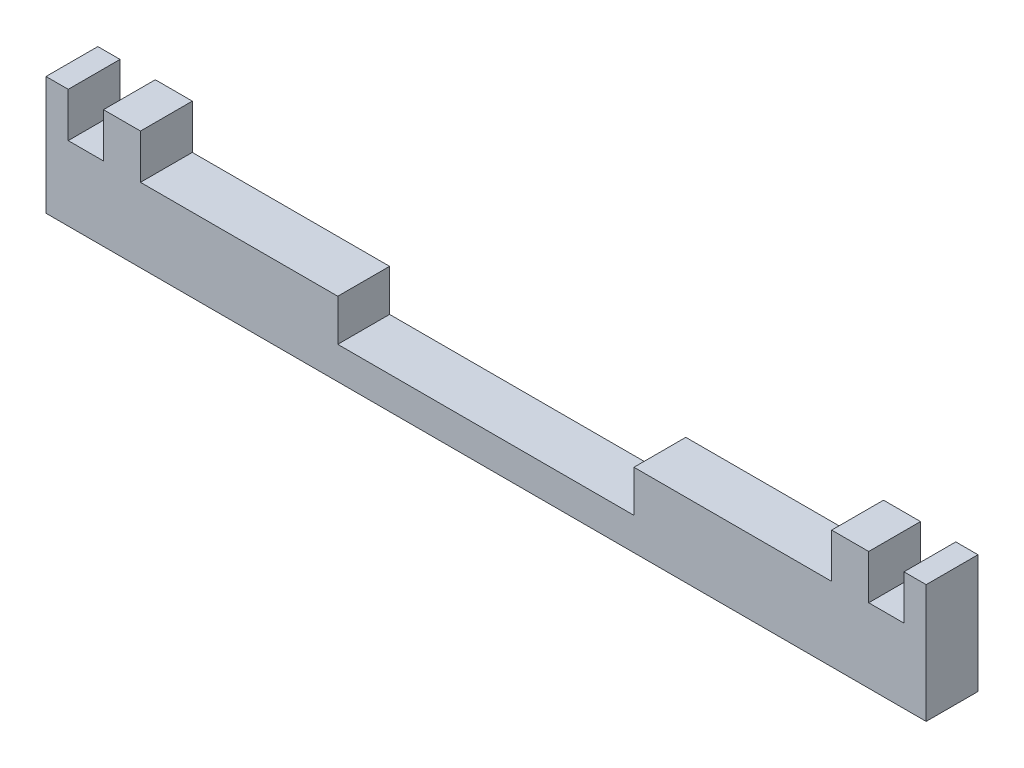
ISO-10303-21;
HEADER;
FILE_DESCRIPTION(('STEP AP214'),'2;1');
FILE_NAME('part.step','',(''),(''),'','','');
FILE_SCHEMA(('AUTOMOTIVE_DESIGN { 1 0 10303 214 1 1 1 1 }'));
ENDSEC;
DATA;
#1=APPLICATION_CONTEXT('core data for automotive mechanical design processes');
#2=APPLICATION_PROTOCOL_DEFINITION('international standard','automotive_design',2000,#1);
#3=PRODUCT_CONTEXT('',#1,'mechanical');
#4=PRODUCT('Part','Part','',(#3));
#5=PRODUCT_RELATED_PRODUCT_CATEGORY('part','',(#4));
#6=PRODUCT_DEFINITION_FORMATION('','',#4);
#7=PRODUCT_DEFINITION_CONTEXT('part definition',#1,'design');
#8=PRODUCT_DEFINITION('design','',#6,#7);
#9=PRODUCT_DEFINITION_SHAPE('','',#8);
#10=(LENGTH_UNIT() NAMED_UNIT(*) SI_UNIT(.MILLI.,.METRE.));
#11=(NAMED_UNIT(*) PLANE_ANGLE_UNIT() SI_UNIT($,.RADIAN.));
#12=(NAMED_UNIT(*) SI_UNIT($,.STERADIAN.) SOLID_ANGLE_UNIT());
#13=UNCERTAINTY_MEASURE_WITH_UNIT(LENGTH_MEASURE(1.E-05),#10,'distance_accuracy_value','');
#14=(GEOMETRIC_REPRESENTATION_CONTEXT(3) GLOBAL_UNCERTAINTY_ASSIGNED_CONTEXT((#13)) GLOBAL_UNIT_ASSIGNED_CONTEXT((#10,
#11,#12)) REPRESENTATION_CONTEXT('',''));
#15=CARTESIAN_POINT('',(0.,0.,0.));
#16=DIRECTION('',(0.,0.,1.));
#17=DIRECTION('',(1.,0.,0.));
#18=AXIS2_PLACEMENT_3D('',#15,#16,#17);
#19=CARTESIAN_POINT('',(39.2998382428941,-10.997149870801,8.89));
#20=DIRECTION('',(0.,-1.,0.));
#21=DIRECTION('',(1.,0.,0.));
#22=AXIS2_PLACEMENT_3D('',#19,#20,#21);
#23=PLANE('',#22);
#24=DIRECTION('',(-1.,0.,0.));
#25=VECTOR('',#24,1.);
#26=CARTESIAN_POINT('',(39.2998382428941,-10.997149870801,8.89));
#27=LINE('',#26,#25);
#28=CARTESIAN_POINT('',(-45.4091617571059,-10.997149870801,8.89));
#29=VERTEX_POINT('',#28);
#30=CARTESIAN_POINT('',(-79.2419617571059,-10.997149870801,8.89));
#31=VERTEX_POINT('',#30);
#32=EDGE_CURVE('E296',#29,#31,#27,.T.);
#33=ORIENTED_EDGE('',*,*,#32,.F.);
#34=DIRECTION('',(0.,0.,1.));
#35=VECTOR('',#34,1.);
#36=CARTESIAN_POINT('',(-45.4091617571059,-10.997149870801,0.));
#37=LINE('',#36,#35);
#38=CARTESIAN_POINT('',(-45.4091617571059,-10.997149870801,0.));
#39=VERTEX_POINT('',#38);
#40=EDGE_CURVE('E196',#39,#29,#37,.T.);
#41=ORIENTED_EDGE('',*,*,#40,.F.);
#42=DIRECTION('',(-1.,0.,0.));
#43=VECTOR('',#42,1.);
#44=CARTESIAN_POINT('',(39.2998382428941,-10.997149870801,0.));
#45=LINE('',#44,#43);
#46=CARTESIAN_POINT('',(-79.2419617571059,-10.997149870801,0.));
#47=VERTEX_POINT('',#46);
#48=EDGE_CURVE('E212',#39,#47,#45,.T.);
#49=ORIENTED_EDGE('',*,*,#48,.T.);
#50=DIRECTION('',(0.,0.,-1.));
#51=VECTOR('',#50,1.);
#52=CARTESIAN_POINT('',(-79.2419617571059,-10.997149870801,8.89));
#53=LINE('',#52,#51);
#54=EDGE_CURVE('E236',#31,#47,#53,.T.);
#55=ORIENTED_EDGE('',*,*,#54,.F.);
#56=EDGE_LOOP('',(#33,#41,#49,#55));
#57=FACE_BOUND('',#56,.T.);
#58=ADVANCED_FACE('F34',(#57),#23,.F.);
#59=CARTESIAN_POINT('',(-95.4471617571059,-3.37714987080101,8.89));
#60=DIRECTION('',(1.,0.,0.));
#61=DIRECTION('',(0.,0.,-1.));
#62=AXIS2_PLACEMENT_3D('',#59,#60,#61);
#63=PLANE('',#62);
#64=DIRECTION('',(0.,-1.,0.));
#65=VECTOR('',#64,1.);
#66=CARTESIAN_POINT('',(-95.4471617571059,-3.37714987080101,0.));
#67=LINE('',#66,#65);
#68=CARTESIAN_POINT('',(-95.4471617571059,-3.37714987080101,0.));
#69=VERTEX_POINT('',#68);
#70=CARTESIAN_POINT('',(-95.4471617571059,-23.697149870801,0.));
#71=VERTEX_POINT('',#70);
#72=EDGE_CURVE('E192',#69,#71,#67,.T.);
#73=ORIENTED_EDGE('',*,*,#72,.T.);
#74=DIRECTION('',(0.,0.,-1.));
#75=VECTOR('',#74,1.);
#76=CARTESIAN_POINT('',(-95.4471617571059,-23.697149870801,8.89));
#77=LINE('',#76,#75);
#78=CARTESIAN_POINT('',(-95.4471617571059,-23.697149870801,8.89));
#79=VERTEX_POINT('',#78);
#80=EDGE_CURVE('E11',#79,#71,#77,.T.);
#81=ORIENTED_EDGE('',*,*,#80,.F.);
#82=DIRECTION('',(0.,-1.,0.));
#83=VECTOR('',#82,1.);
#84=CARTESIAN_POINT('',(-95.4471617571059,-3.37714987080101,8.89));
#85=LINE('',#84,#83);
#86=CARTESIAN_POINT('',(-95.4471617571059,-3.37714987080101,8.89));
#87=VERTEX_POINT('',#86);
#88=EDGE_CURVE('E226',#87,#79,#85,.T.);
#89=ORIENTED_EDGE('',*,*,#88,.F.);
#90=DIRECTION('',(0.,0.,-1.));
#91=VECTOR('',#90,1.);
#92=CARTESIAN_POINT('',(-95.4471617571059,-3.37714987080101,8.89));
#93=LINE('',#92,#91);
#94=EDGE_CURVE('E188',#87,#69,#93,.T.);
#95=ORIENTED_EDGE('',*,*,#94,.T.);
#96=EDGE_LOOP('',(#73,#81,#89,#95));
#97=FACE_BOUND('',#96,.T.);
#98=ADVANCED_FACE('F36',(#97),#63,.F.);
#99=CARTESIAN_POINT('',(-95.4471617571059,-23.697149870801,8.89));
#100=DIRECTION('',(0.,1.,0.));
#101=DIRECTION('',(0.,0.,1.));
#102=AXIS2_PLACEMENT_3D('',#99,#100,#101);
#103=PLANE('',#102);
#104=DIRECTION('',(1.,0.,0.));
#105=VECTOR('',#104,1.);
#106=CARTESIAN_POINT('',(-95.4471617571059,-23.697149870801,0.));
#107=LINE('',#106,#105);
#108=CARTESIAN_POINT('',(55.5050382428941,-23.697149870801,0.));
#109=VERTEX_POINT('',#108);
#110=EDGE_CURVE('E195',#71,#109,#107,.T.);
#111=ORIENTED_EDGE('',*,*,#110,.T.);
#112=DIRECTION('',(0.,0.,-1.));
#113=VECTOR('',#112,1.);
#114=CARTESIAN_POINT('',(55.5050382428941,-23.697149870801,8.89));
#115=LINE('',#114,#113);
#116=CARTESIAN_POINT('',(55.5050382428941,-23.697149870801,8.89));
#117=VERTEX_POINT('',#116);
#118=EDGE_CURVE('E42',#117,#109,#115,.T.);
#119=ORIENTED_EDGE('',*,*,#118,.F.);
#120=DIRECTION('',(1.,0.,0.));
#121=VECTOR('',#120,1.);
#122=CARTESIAN_POINT('',(-95.4471617571059,-23.697149870801,8.89));
#123=LINE('',#122,#121);
#124=EDGE_CURVE('E123',#79,#117,#123,.T.);
#125=ORIENTED_EDGE('',*,*,#124,.F.);
#126=ORIENTED_EDGE('',*,*,#80,.T.);
#127=EDGE_LOOP('',(#111,#119,#125,#126));
#128=FACE_BOUND('',#127,.T.);
#129=ADVANCED_FACE('F404',(#128),#103,.F.);
#130=CARTESIAN_POINT('',(55.5050382428941,-23.697149870801,8.89));
#131=DIRECTION('',(-1.,0.,0.));
#132=DIRECTION('',(0.,0.,1.));
#133=AXIS2_PLACEMENT_3D('',#130,#131,#132);
#134=PLANE('',#133);
#135=DIRECTION('',(0.,1.,0.));
#136=VECTOR('',#135,1.);
#137=CARTESIAN_POINT('',(55.5050382428941,-23.697149870801,0.));
#138=LINE('',#137,#136);
#139=CARTESIAN_POINT('',(55.5050382428941,-3.37714987080099,0.));
#140=VERTEX_POINT('',#139);
#141=EDGE_CURVE('E198',#109,#140,#138,.T.);
#142=ORIENTED_EDGE('',*,*,#141,.T.);
#143=DIRECTION('',(0.,0.,-1.));
#144=VECTOR('',#143,1.);
#145=CARTESIAN_POINT('',(55.5050382428941,-3.37714987080099,8.89));
#146=LINE('',#145,#144);
#147=CARTESIAN_POINT('',(55.5050382428941,-3.37714987080099,8.89));
#148=VERTEX_POINT('',#147);
#149=EDGE_CURVE('E257',#148,#140,#146,.T.);
#150=ORIENTED_EDGE('',*,*,#149,.F.);
#151=DIRECTION('',(0.,1.,0.));
#152=VECTOR('',#151,1.);
#153=CARTESIAN_POINT('',(55.5050382428941,-23.697149870801,8.89));
#154=LINE('',#153,#152);
#155=EDGE_CURVE('E265',#117,#148,#154,.T.);
#156=ORIENTED_EDGE('',*,*,#155,.F.);
#157=ORIENTED_EDGE('',*,*,#118,.T.);
#158=EDGE_LOOP('',(#142,#150,#156,#157));
#159=FACE_BOUND('',#158,.T.);
#160=ADVANCED_FACE('F263',(#159),#134,.F.);
#161=CARTESIAN_POINT('',(55.5050382428941,-3.37714987080099,8.89));
#162=DIRECTION('',(0.,-1.,0.));
#163=DIRECTION('',(0.,0.,-1.));
#164=AXIS2_PLACEMENT_3D('',#161,#162,#163);
#165=PLANE('',#164);
#166=DIRECTION('',(-1.,0.,0.));
#167=VECTOR('',#166,1.);
#168=CARTESIAN_POINT('',(55.5050382428941,-3.37714987080099,0.));
#169=LINE('',#168,#167);
#170=CARTESIAN_POINT('',(51.6950382428941,-3.37714987080099,0.));
#171=VERTEX_POINT('',#170);
#172=EDGE_CURVE('E200',#140,#171,#169,.T.);
#173=ORIENTED_EDGE('',*,*,#172,.T.);
#174=DIRECTION('',(0.,0.,-1.));
#175=VECTOR('',#174,1.);
#176=CARTESIAN_POINT('',(51.6950382428941,-3.37714987080099,8.89));
#177=LINE('',#176,#175);
#178=CARTESIAN_POINT('',(51.6950382428941,-3.37714987080099,8.89));
#179=VERTEX_POINT('',#178);
#180=EDGE_CURVE('E254',#179,#171,#177,.T.);
#181=ORIENTED_EDGE('',*,*,#180,.F.);
#182=DIRECTION('',(-1.,0.,0.));
#183=VECTOR('',#182,1.);
#184=CARTESIAN_POINT('',(55.5050382428941,-3.37714987080099,8.89));
#185=LINE('',#184,#183);
#186=EDGE_CURVE('E284',#148,#179,#185,.T.);
#187=ORIENTED_EDGE('',*,*,#186,.F.);
#188=ORIENTED_EDGE('',*,*,#149,.T.);
#189=EDGE_LOOP('',(#173,#181,#187,#188));
#190=FACE_BOUND('',#189,.T.);
#191=ADVANCED_FACE('F275',(#190),#165,.F.);
#192=CARTESIAN_POINT('',(51.6950382428941,-3.37714987080099,8.89));
#193=DIRECTION('',(1.,0.,0.));
#194=DIRECTION('',(0.,0.,-1.));
#195=AXIS2_PLACEMENT_3D('',#192,#193,#194);
#196=PLANE('',#195);
#197=DIRECTION('',(0.,-1.,0.));
#198=VECTOR('',#197,1.);
#199=CARTESIAN_POINT('',(51.6950382428941,-3.37714987080099,0.));
#200=LINE('',#199,#198);
#201=CARTESIAN_POINT('',(51.6950382428941,-10.997149870801,0.));
#202=VERTEX_POINT('',#201);
#203=EDGE_CURVE('E202',#171,#202,#200,.T.);
#204=ORIENTED_EDGE('',*,*,#203,.T.);
#205=DIRECTION('',(0.,0.,-1.));
#206=VECTOR('',#205,1.);
#207=CARTESIAN_POINT('',(51.6950382428941,-10.997149870801,8.89));
#208=LINE('',#207,#206);
#209=CARTESIAN_POINT('',(51.6950382428941,-10.997149870801,8.89));
#210=VERTEX_POINT('',#209);
#211=EDGE_CURVE('E251',#210,#202,#208,.T.);
#212=ORIENTED_EDGE('',*,*,#211,.F.);
#213=DIRECTION('',(0.,-1.,0.));
#214=VECTOR('',#213,1.);
#215=CARTESIAN_POINT('',(51.6950382428941,-3.37714987080099,8.89));
#216=LINE('',#215,#214);
#217=EDGE_CURVE('E281',#179,#210,#216,.T.);
#218=ORIENTED_EDGE('',*,*,#217,.F.);
#219=ORIENTED_EDGE('',*,*,#180,.T.);
#220=EDGE_LOOP('',(#204,#212,#218,#219));
#221=FACE_BOUND('',#220,.T.);
#222=ADVANCED_FACE('F279',(#221),#196,.F.);
#223=CARTESIAN_POINT('',(51.6950382428941,-10.997149870801,8.89));
#224=DIRECTION('',(0.,-1.,0.));
#225=DIRECTION('',(1.,0.,0.));
#226=AXIS2_PLACEMENT_3D('',#223,#224,#225);
#227=PLANE('',#226);
#228=DIRECTION('',(-1.,0.,0.));
#229=VECTOR('',#228,1.);
#230=CARTESIAN_POINT('',(51.6950382428941,-10.997149870801,0.));
#231=LINE('',#230,#229);
#232=CARTESIAN_POINT('',(45.6498382428941,-10.997149870801,0.));
#233=VERTEX_POINT('',#232);
#234=EDGE_CURVE('E204',#202,#233,#231,.T.);
#235=ORIENTED_EDGE('',*,*,#234,.T.);
#236=DIRECTION('',(0.,0.,-1.));
#237=VECTOR('',#236,1.);
#238=CARTESIAN_POINT('',(45.6498382428941,-10.997149870801,8.89));
#239=LINE('',#238,#237);
#240=CARTESIAN_POINT('',(45.6498382428941,-10.997149870801,8.89));
#241=VERTEX_POINT('',#240);
#242=EDGE_CURVE('E248',#241,#233,#239,.T.);
#243=ORIENTED_EDGE('',*,*,#242,.F.);
#244=DIRECTION('',(-1.,0.,0.));
#245=VECTOR('',#244,1.);
#246=CARTESIAN_POINT('',(51.6950382428941,-10.997149870801,8.89));
#247=LINE('',#246,#245);
#248=EDGE_CURVE('E283',#210,#241,#247,.T.);
#249=ORIENTED_EDGE('',*,*,#248,.F.);
#250=ORIENTED_EDGE('',*,*,#211,.T.);
#251=EDGE_LOOP('',(#235,#243,#249,#250));
#252=FACE_BOUND('',#251,.T.);
#253=ADVANCED_FACE('F390',(#252),#227,.F.);
#254=CARTESIAN_POINT('',(45.6498382428941,-10.997149870801,8.89));
#255=DIRECTION('',(-1.,0.,0.));
#256=DIRECTION('',(0.,0.,1.));
#257=AXIS2_PLACEMENT_3D('',#254,#255,#256);
#258=PLANE('',#257);
#259=DIRECTION('',(0.,1.,0.));
#260=VECTOR('',#259,1.);
#261=CARTESIAN_POINT('',(45.6498382428941,-10.997149870801,0.));
#262=LINE('',#261,#260);
#263=CARTESIAN_POINT('',(45.6498382428941,-3.377149870801,0.));
#264=VERTEX_POINT('',#263);
#265=EDGE_CURVE('E206',#233,#264,#262,.T.);
#266=ORIENTED_EDGE('',*,*,#265,.T.);
#267=DIRECTION('',(0.,0.,-1.));
#268=VECTOR('',#267,1.);
#269=CARTESIAN_POINT('',(45.6498382428941,-3.377149870801,8.89));
#270=LINE('',#269,#268);
#271=CARTESIAN_POINT('',(45.6498382428941,-3.377149870801,8.89));
#272=VERTEX_POINT('',#271);
#273=EDGE_CURVE('E245',#272,#264,#270,.T.);
#274=ORIENTED_EDGE('',*,*,#273,.F.);
#275=DIRECTION('',(0.,1.,0.));
#276=VECTOR('',#275,1.);
#277=CARTESIAN_POINT('',(45.6498382428941,-10.997149870801,8.89));
#278=LINE('',#277,#276);
#279=EDGE_CURVE('E286',#241,#272,#278,.T.);
#280=ORIENTED_EDGE('',*,*,#279,.F.);
#281=ORIENTED_EDGE('',*,*,#242,.T.);
#282=EDGE_LOOP('',(#266,#274,#280,#281));
#283=FACE_BOUND('',#282,.T.);
#284=ADVANCED_FACE('F387',(#283),#258,.F.);
#285=CARTESIAN_POINT('',(45.6498382428941,-3.377149870801,8.89));
#286=DIRECTION('',(0.,-1.,0.));
#287=DIRECTION('',(1.,0.,0.));
#288=AXIS2_PLACEMENT_3D('',#285,#286,#287);
#289=PLANE('',#288);
#290=DIRECTION('',(-1.,0.,0.));
#291=VECTOR('',#290,1.);
#292=CARTESIAN_POINT('',(45.6498382428941,-3.377149870801,0.));
#293=LINE('',#292,#291);
#294=CARTESIAN_POINT('',(39.2998382428941,-3.377149870801,0.));
#295=VERTEX_POINT('',#294);
#296=EDGE_CURVE('E208',#264,#295,#293,.T.);
#297=ORIENTED_EDGE('',*,*,#296,.T.);
#298=DIRECTION('',(0.,0.,-1.));
#299=VECTOR('',#298,1.);
#300=CARTESIAN_POINT('',(39.2998382428941,-3.377149870801,8.89));
#301=LINE('',#300,#299);
#302=CARTESIAN_POINT('',(39.2998382428941,-3.377149870801,8.89));
#303=VERTEX_POINT('',#302);
#304=EDGE_CURVE('E242',#303,#295,#301,.T.);
#305=ORIENTED_EDGE('',*,*,#304,.F.);
#306=DIRECTION('',(-1.,0.,0.));
#307=VECTOR('',#306,1.);
#308=CARTESIAN_POINT('',(45.6498382428941,-3.377149870801,8.89));
#309=LINE('',#308,#307);
#310=EDGE_CURVE('E292',#272,#303,#309,.T.);
#311=ORIENTED_EDGE('',*,*,#310,.F.);
#312=ORIENTED_EDGE('',*,*,#273,.T.);
#313=EDGE_LOOP('',(#297,#305,#311,#312));
#314=FACE_BOUND('',#313,.T.);
#315=ADVANCED_FACE('F383',(#314),#289,.F.);
#316=CARTESIAN_POINT('',(39.2998382428941,-3.377149870801,8.89));
#317=DIRECTION('',(1.,0.,0.));
#318=DIRECTION('',(0.,0.,-1.));
#319=AXIS2_PLACEMENT_3D('',#316,#317,#318);
#320=PLANE('',#319);
#321=DIRECTION('',(0.,-1.,0.));
#322=VECTOR('',#321,1.);
#323=CARTESIAN_POINT('',(39.2998382428941,-3.377149870801,0.));
#324=LINE('',#323,#322);
#325=CARTESIAN_POINT('',(39.2998382428941,-10.997149870801,0.));
#326=VERTEX_POINT('',#325);
#327=EDGE_CURVE('E210',#295,#326,#324,.T.);
#328=ORIENTED_EDGE('',*,*,#327,.T.);
#329=DIRECTION('',(0.,0.,-1.));
#330=VECTOR('',#329,1.);
#331=CARTESIAN_POINT('',(39.2998382428941,-10.997149870801,8.89));
#332=LINE('',#331,#330);
#333=CARTESIAN_POINT('',(39.2998382428941,-10.997149870801,8.89));
#334=VERTEX_POINT('',#333);
#335=EDGE_CURVE('E239',#334,#326,#332,.T.);
#336=ORIENTED_EDGE('',*,*,#335,.F.);
#337=DIRECTION('',(0.,-1.,0.));
#338=VECTOR('',#337,1.);
#339=CARTESIAN_POINT('',(39.2998382428941,-3.377149870801,8.89));
#340=LINE('',#339,#338);
#341=EDGE_CURVE('E294',#303,#334,#340,.T.);
#342=ORIENTED_EDGE('',*,*,#341,.F.);
#343=ORIENTED_EDGE('',*,*,#304,.T.);
#344=EDGE_LOOP('',(#328,#336,#342,#343));
#345=FACE_BOUND('',#344,.T.);
#346=ADVANCED_FACE('F378',(#345),#320,.F.);
#347=CARTESIAN_POINT('',(5.39083824289407,-10.997149870801,0.));
#348=VERTEX_POINT('',#347);
#349=EDGE_CURVE('E213',#326,#348,#45,.T.);
#350=ORIENTED_EDGE('',*,*,#349,.T.);
#351=DIRECTION('',(0.,0.,1.));
#352=VECTOR('',#351,1.);
#353=CARTESIAN_POINT('',(5.39083824289407,-10.997149870801,0.));
#354=LINE('',#353,#352);
#355=CARTESIAN_POINT('',(5.39083824289407,-10.997149870801,8.89));
#356=VERTEX_POINT('',#355);
#357=EDGE_CURVE('E325',#348,#356,#354,.T.);
#358=ORIENTED_EDGE('',*,*,#357,.T.);
#359=EDGE_CURVE('E297',#334,#356,#27,.T.);
#360=ORIENTED_EDGE('',*,*,#359,.F.);
#361=ORIENTED_EDGE('',*,*,#335,.T.);
#362=EDGE_LOOP('',(#350,#358,#360,#361));
#363=FACE_BOUND('',#362,.T.);
#364=ADVANCED_FACE('F371',(#363),#23,.F.);
#365=CARTESIAN_POINT('',(-79.2419617571059,-10.997149870801,8.89));
#366=DIRECTION('',(-1.,0.,0.));
#367=DIRECTION('',(0.,0.,1.));
#368=AXIS2_PLACEMENT_3D('',#365,#366,#367);
#369=PLANE('',#368);
#370=DIRECTION('',(0.,1.,0.));
#371=VECTOR('',#370,1.);
#372=CARTESIAN_POINT('',(-79.2419617571059,-10.997149870801,0.));
#373=LINE('',#372,#371);
#374=CARTESIAN_POINT('',(-79.2419617571059,-3.37714987080101,0.));
#375=VERTEX_POINT('',#374);
#376=EDGE_CURVE('E216',#47,#375,#373,.T.);
#377=ORIENTED_EDGE('',*,*,#376,.T.);
#378=DIRECTION('',(0.,0.,-1.));
#379=VECTOR('',#378,1.);
#380=CARTESIAN_POINT('',(-79.2419617571059,-3.37714987080101,8.89));
#381=LINE('',#380,#379);
#382=CARTESIAN_POINT('',(-79.2419617571059,-3.37714987080101,8.89));
#383=VERTEX_POINT('',#382);
#384=EDGE_CURVE('E233',#383,#375,#381,.T.);
#385=ORIENTED_EDGE('',*,*,#384,.F.);
#386=DIRECTION('',(0.,1.,0.));
#387=VECTOR('',#386,1.);
#388=CARTESIAN_POINT('',(-79.2419617571059,-10.997149870801,8.89));
#389=LINE('',#388,#387);
#390=EDGE_CURVE('E300',#31,#383,#389,.T.);
#391=ORIENTED_EDGE('',*,*,#390,.F.);
#392=ORIENTED_EDGE('',*,*,#54,.T.);
#393=EDGE_LOOP('',(#377,#385,#391,#392));
#394=FACE_BOUND('',#393,.T.);
#395=ADVANCED_FACE('F408',(#394),#369,.F.);
#396=CARTESIAN_POINT('',(-79.2419617571059,-3.37714987080101,8.89));
#397=DIRECTION('',(0.,-1.,0.));
#398=DIRECTION('',(1.,0.,0.));
#399=AXIS2_PLACEMENT_3D('',#396,#397,#398);
#400=PLANE('',#399);
#401=DIRECTION('',(-1.,0.,0.));
#402=VECTOR('',#401,1.);
#403=CARTESIAN_POINT('',(-79.2419617571059,-3.37714987080101,0.));
#404=LINE('',#403,#402);
#405=CARTESIAN_POINT('',(-85.5919617571059,-3.37714987080101,0.));
#406=VERTEX_POINT('',#405);
#407=EDGE_CURVE('E218',#375,#406,#404,.T.);
#408=ORIENTED_EDGE('',*,*,#407,.T.);
#409=DIRECTION('',(0.,0.,-1.));
#410=VECTOR('',#409,1.);
#411=CARTESIAN_POINT('',(-85.5919617571059,-3.37714987080101,8.89));
#412=LINE('',#411,#410);
#413=CARTESIAN_POINT('',(-85.5919617571059,-3.37714987080101,8.89));
#414=VERTEX_POINT('',#413);
#415=EDGE_CURVE('E230',#414,#406,#412,.T.);
#416=ORIENTED_EDGE('',*,*,#415,.F.);
#417=DIRECTION('',(-1.,0.,0.));
#418=VECTOR('',#417,1.);
#419=CARTESIAN_POINT('',(-79.2419617571059,-3.37714987080101,8.89));
#420=LINE('',#419,#418);
#421=EDGE_CURVE('E302',#383,#414,#420,.T.);
#422=ORIENTED_EDGE('',*,*,#421,.F.);
#423=ORIENTED_EDGE('',*,*,#384,.T.);
#424=EDGE_LOOP('',(#408,#416,#422,#423));
#425=FACE_BOUND('',#424,.T.);
#426=ADVANCED_FACE('F308',(#425),#400,.F.);
#427=CARTESIAN_POINT('',(-85.5919617571059,-3.37714987080101,8.89));
#428=DIRECTION('',(1.,0.,0.));
#429=DIRECTION('',(0.,0.,-1.));
#430=AXIS2_PLACEMENT_3D('',#427,#428,#429);
#431=PLANE('',#430);
#432=DIRECTION('',(0.,-1.,0.));
#433=VECTOR('',#432,1.);
#434=CARTESIAN_POINT('',(-85.5919617571059,-3.37714987080101,0.));
#435=LINE('',#434,#433);
#436=CARTESIAN_POINT('',(-85.5919617571059,-10.997149870801,0.));
#437=VERTEX_POINT('',#436);
#438=EDGE_CURVE('E220',#406,#437,#435,.T.);
#439=ORIENTED_EDGE('',*,*,#438,.T.);
#440=DIRECTION('',(0.,0.,-1.));
#441=VECTOR('',#440,1.);
#442=CARTESIAN_POINT('',(-85.5919617571059,-10.997149870801,8.89));
#443=LINE('',#442,#441);
#444=CARTESIAN_POINT('',(-85.5919617571059,-10.997149870801,8.89));
#445=VERTEX_POINT('',#444);
#446=EDGE_CURVE('E183',#445,#437,#443,.T.);
#447=ORIENTED_EDGE('',*,*,#446,.F.);
#448=DIRECTION('',(0.,-1.,0.));
#449=VECTOR('',#448,1.);
#450=CARTESIAN_POINT('',(-85.5919617571059,-3.37714987080101,8.89));
#451=LINE('',#450,#449);
#452=EDGE_CURVE('E171',#414,#445,#451,.T.);
#453=ORIENTED_EDGE('',*,*,#452,.F.);
#454=ORIENTED_EDGE('',*,*,#415,.T.);
#455=EDGE_LOOP('',(#439,#447,#453,#454));
#456=FACE_BOUND('',#455,.T.);
#457=ADVANCED_FACE('F312',(#456),#431,.F.);
#458=CARTESIAN_POINT('',(-85.5919617571059,-10.997149870801,8.89));
#459=DIRECTION('',(0.,-1.,0.));
#460=DIRECTION('',(1.,0.,0.));
#461=AXIS2_PLACEMENT_3D('',#458,#459,#460);
#462=PLANE('',#461);
#463=DIRECTION('',(-1.,0.,0.));
#464=VECTOR('',#463,1.);
#465=CARTESIAN_POINT('',(-85.5919617571059,-10.997149870801,0.));
#466=LINE('',#465,#464);
#467=CARTESIAN_POINT('',(-91.6371617571059,-10.997149870801,0.));
#468=VERTEX_POINT('',#467);
#469=EDGE_CURVE('E180',#437,#468,#466,.T.);
#470=ORIENTED_EDGE('',*,*,#469,.T.);
#471=DIRECTION('',(0.,0.,-1.));
#472=VECTOR('',#471,1.);
#473=CARTESIAN_POINT('',(-91.6371617571059,-10.997149870801,8.89));
#474=LINE('',#473,#472);
#475=CARTESIAN_POINT('',(-91.6371617571059,-10.997149870801,8.89));
#476=VERTEX_POINT('',#475);
#477=EDGE_CURVE('E177',#476,#468,#474,.T.);
#478=ORIENTED_EDGE('',*,*,#477,.F.);
#479=DIRECTION('',(-1.,0.,0.));
#480=VECTOR('',#479,1.);
#481=CARTESIAN_POINT('',(-85.5919617571059,-10.997149870801,8.89));
#482=LINE('',#481,#480);
#483=EDGE_CURVE('E163',#445,#476,#482,.T.);
#484=ORIENTED_EDGE('',*,*,#483,.F.);
#485=ORIENTED_EDGE('',*,*,#446,.T.);
#486=EDGE_LOOP('',(#470,#478,#484,#485));
#487=FACE_BOUND('',#486,.T.);
#488=ADVANCED_FACE('F178',(#487),#462,.F.);
#489=CARTESIAN_POINT('',(-91.6371617571059,-10.997149870801,8.89));
#490=DIRECTION('',(-1.,0.,0.));
#491=DIRECTION('',(0.,0.,1.));
#492=AXIS2_PLACEMENT_3D('',#489,#490,#491);
#493=PLANE('',#492);
#494=DIRECTION('',(0.,1.,0.));
#495=VECTOR('',#494,1.);
#496=CARTESIAN_POINT('',(-91.6371617571059,-10.997149870801,0.));
#497=LINE('',#496,#495);
#498=CARTESIAN_POINT('',(-91.6371617571059,-3.37714987080101,0.));
#499=VERTEX_POINT('',#498);
#500=EDGE_CURVE('E223',#468,#499,#497,.T.);
#501=ORIENTED_EDGE('',*,*,#500,.T.);
#502=DIRECTION('',(0.,0.,-1.));
#503=VECTOR('',#502,1.);
#504=CARTESIAN_POINT('',(-91.6371617571059,-3.37714987080101,8.89));
#505=LINE('',#504,#503);
#506=CARTESIAN_POINT('',(-91.6371617571059,-3.37714987080101,8.89));
#507=VERTEX_POINT('',#506);
#508=EDGE_CURVE('E184',#507,#499,#505,.T.);
#509=ORIENTED_EDGE('',*,*,#508,.F.);
#510=DIRECTION('',(0.,1.,0.));
#511=VECTOR('',#510,1.);
#512=CARTESIAN_POINT('',(-91.6371617571059,-10.997149870801,8.89));
#513=LINE('',#512,#511);
#514=EDGE_CURVE('E168',#476,#507,#513,.T.);
#515=ORIENTED_EDGE('',*,*,#514,.F.);
#516=ORIENTED_EDGE('',*,*,#477,.T.);
#517=EDGE_LOOP('',(#501,#509,#515,#516));
#518=FACE_BOUND('',#517,.T.);
#519=ADVANCED_FACE('F186',(#518),#493,.F.);
#520=CARTESIAN_POINT('',(-91.6371617571059,-3.37714987080101,8.89));
#521=DIRECTION('',(0.,-1.,0.));
#522=DIRECTION('',(1.,0.,0.));
#523=AXIS2_PLACEMENT_3D('',#520,#521,#522);
#524=PLANE('',#523);
#525=DIRECTION('',(-1.,0.,0.));
#526=VECTOR('',#525,1.);
#527=CARTESIAN_POINT('',(-91.6371617571059,-3.37714987080101,0.));
#528=LINE('',#527,#526);
#529=EDGE_CURVE('E115',#499,#69,#528,.T.);
#530=ORIENTED_EDGE('',*,*,#529,.T.);
#531=ORIENTED_EDGE('',*,*,#94,.F.);
#532=DIRECTION('',(-1.,0.,0.));
#533=VECTOR('',#532,1.);
#534=CARTESIAN_POINT('',(-91.6371617571059,-3.37714987080101,8.89));
#535=LINE('',#534,#533);
#536=EDGE_CURVE('E58',#507,#87,#535,.T.);
#537=ORIENTED_EDGE('',*,*,#536,.F.);
#538=ORIENTED_EDGE('',*,*,#508,.T.);
#539=EDGE_LOOP('',(#530,#531,#537,#538));
#540=FACE_BOUND('',#539,.T.);
#541=ADVANCED_FACE('F313',(#540),#524,.F.);
#542=CARTESIAN_POINT('',(0.,0.,8.89));
#543=DIRECTION('',(0.,0.,1.));
#544=DIRECTION('',(1.,0.,0.));
#545=AXIS2_PLACEMENT_3D('',#542,#543,#544);
#546=PLANE('',#545);
#547=DIRECTION('',(0.,-1.,0.));
#548=VECTOR('',#547,1.);
#549=CARTESIAN_POINT('',(-45.4091617571059,-10.997149870801,8.89));
#550=LINE('',#549,#548);
#551=CARTESIAN_POINT('',(-45.4091617571059,-18.140899870801,8.89));
#552=VERTEX_POINT('',#551);
#553=EDGE_CURVE('E337',#29,#552,#550,.T.);
#554=ORIENTED_EDGE('',*,*,#553,.F.);
#555=ORIENTED_EDGE('',*,*,#32,.T.);
#556=ORIENTED_EDGE('',*,*,#390,.T.);
#557=ORIENTED_EDGE('',*,*,#421,.T.);
#558=ORIENTED_EDGE('',*,*,#452,.T.);
#559=ORIENTED_EDGE('',*,*,#483,.T.);
#560=ORIENTED_EDGE('',*,*,#514,.T.);
#561=ORIENTED_EDGE('',*,*,#536,.T.);
#562=ORIENTED_EDGE('',*,*,#88,.T.);
#563=ORIENTED_EDGE('',*,*,#124,.T.);
#564=ORIENTED_EDGE('',*,*,#155,.T.);
#565=ORIENTED_EDGE('',*,*,#186,.T.);
#566=ORIENTED_EDGE('',*,*,#217,.T.);
#567=ORIENTED_EDGE('',*,*,#248,.T.);
#568=ORIENTED_EDGE('',*,*,#279,.T.);
#569=ORIENTED_EDGE('',*,*,#310,.T.);
#570=ORIENTED_EDGE('',*,*,#341,.T.);
#571=ORIENTED_EDGE('',*,*,#359,.T.);
#572=DIRECTION('',(0.,1.,0.));
#573=VECTOR('',#572,1.);
#574=CARTESIAN_POINT('',(5.39083824289407,-10.997149870801,8.89));
#575=LINE('',#574,#573);
#576=CARTESIAN_POINT('',(5.39083824289407,-18.140899870801,8.89));
#577=VERTEX_POINT('',#576);
#578=EDGE_CURVE('E330',#577,#356,#575,.T.);
#579=ORIENTED_EDGE('',*,*,#578,.F.);
#580=DIRECTION('',(1.,0.,0.));
#581=VECTOR('',#580,1.);
#582=CARTESIAN_POINT('',(-45.4091617571059,-18.140899870801,8.89));
#583=LINE('',#582,#581);
#584=EDGE_CURVE('E334',#552,#577,#583,.T.);
#585=ORIENTED_EDGE('',*,*,#584,.F.);
#586=EDGE_LOOP('',(#554,#555,#556,#557,#558,#559,#560,#561,#562,#563,#564,#565,#566,#567,#568,
#569,#570,#571,#579,#585));
#587=FACE_BOUND('',#586,.T.);
#588=ADVANCED_FACE('F166',(#587),#546,.T.);
#589=CARTESIAN_POINT('',(0.,0.,0.));
#590=DIRECTION('',(0.,0.,1.));
#591=DIRECTION('',(1.,0.,0.));
#592=AXIS2_PLACEMENT_3D('',#589,#590,#591);
#593=PLANE('',#592);
#594=ORIENTED_EDGE('',*,*,#48,.F.);
#595=DIRECTION('',(0.,-1.,0.));
#596=VECTOR('',#595,1.);
#597=CARTESIAN_POINT('',(-45.4091617571059,-10.997149870801,0.));
#598=LINE('',#597,#596);
#599=CARTESIAN_POINT('',(-45.4091617571059,-18.140899870801,0.));
#600=VERTEX_POINT('',#599);
#601=EDGE_CURVE('E333',#39,#600,#598,.T.);
#602=ORIENTED_EDGE('',*,*,#601,.T.);
#603=DIRECTION('',(1.,0.,0.));
#604=VECTOR('',#603,1.);
#605=CARTESIAN_POINT('',(-45.4091617571059,-18.140899870801,0.));
#606=LINE('',#605,#604);
#607=CARTESIAN_POINT('',(5.39083824289407,-18.140899870801,0.));
#608=VERTEX_POINT('',#607);
#609=EDGE_CURVE('E341',#600,#608,#606,.T.);
#610=ORIENTED_EDGE('',*,*,#609,.T.);
#611=DIRECTION('',(0.,1.,0.));
#612=VECTOR('',#611,1.);
#613=CARTESIAN_POINT('',(5.39083824289407,-10.997149870801,0.));
#614=LINE('',#613,#612);
#615=EDGE_CURVE('E49',#608,#348,#614,.T.);
#616=ORIENTED_EDGE('',*,*,#615,.T.);
#617=ORIENTED_EDGE('',*,*,#349,.F.);
#618=ORIENTED_EDGE('',*,*,#327,.F.);
#619=ORIENTED_EDGE('',*,*,#296,.F.);
#620=ORIENTED_EDGE('',*,*,#265,.F.);
#621=ORIENTED_EDGE('',*,*,#234,.F.);
#622=ORIENTED_EDGE('',*,*,#203,.F.);
#623=ORIENTED_EDGE('',*,*,#172,.F.);
#624=ORIENTED_EDGE('',*,*,#141,.F.);
#625=ORIENTED_EDGE('',*,*,#110,.F.);
#626=ORIENTED_EDGE('',*,*,#72,.F.);
#627=ORIENTED_EDGE('',*,*,#529,.F.);
#628=ORIENTED_EDGE('',*,*,#500,.F.);
#629=ORIENTED_EDGE('',*,*,#469,.F.);
#630=ORIENTED_EDGE('',*,*,#438,.F.);
#631=ORIENTED_EDGE('',*,*,#407,.F.);
#632=ORIENTED_EDGE('',*,*,#376,.F.);
#633=EDGE_LOOP('',(#594,#602,#610,#616,#617,#618,#619,#620,#621,#622,#623,#624,#625,#626,#627,
#628,#629,#630,#631,#632));
#634=FACE_BOUND('',#633,.T.);
#635=ADVANCED_FACE('F269',(#634),#593,.F.);
#636=CARTESIAN_POINT('',(-45.4091617571059,-10.997149870801,0.));
#637=DIRECTION('',(-1.,0.,0.));
#638=DIRECTION('',(0.,0.,1.));
#639=AXIS2_PLACEMENT_3D('',#636,#637,#638);
#640=PLANE('',#639);
#641=ORIENTED_EDGE('',*,*,#553,.T.);
#642=DIRECTION('',(0.,0.,1.));
#643=VECTOR('',#642,1.);
#644=CARTESIAN_POINT('',(-45.4091617571059,-18.140899870801,0.));
#645=LINE('',#644,#643);
#646=EDGE_CURVE('E320',#600,#552,#645,.T.);
#647=ORIENTED_EDGE('',*,*,#646,.F.);
#648=ORIENTED_EDGE('',*,*,#601,.F.);
#649=ORIENTED_EDGE('',*,*,#40,.T.);
#650=EDGE_LOOP('',(#641,#647,#648,#649));
#651=FACE_BOUND('',#650,.T.);
#652=ADVANCED_FACE('F354',(#651),#640,.F.);
#653=CARTESIAN_POINT('',(5.39083824289407,-10.997149870801,0.));
#654=DIRECTION('',(1.,0.,0.));
#655=DIRECTION('',(0.,0.,-1.));
#656=AXIS2_PLACEMENT_3D('',#653,#654,#655);
#657=PLANE('',#656);
#658=ORIENTED_EDGE('',*,*,#578,.T.);
#659=ORIENTED_EDGE('',*,*,#357,.F.);
#660=ORIENTED_EDGE('',*,*,#615,.F.);
#661=DIRECTION('',(0.,0.,1.));
#662=VECTOR('',#661,1.);
#663=CARTESIAN_POINT('',(5.39083824289407,-18.140899870801,0.));
#664=LINE('',#663,#662);
#665=EDGE_CURVE('E323',#608,#577,#664,.T.);
#666=ORIENTED_EDGE('',*,*,#665,.T.);
#667=EDGE_LOOP('',(#658,#659,#660,#666));
#668=FACE_BOUND('',#667,.T.);
#669=ADVANCED_FACE('F368',(#668),#657,.F.);
#670=CARTESIAN_POINT('',(-45.4091617571059,-18.140899870801,0.));
#671=DIRECTION('',(0.,-1.,0.));
#672=DIRECTION('',(1.,0.,0.));
#673=AXIS2_PLACEMENT_3D('',#670,#671,#672);
#674=PLANE('',#673);
#675=ORIENTED_EDGE('',*,*,#584,.T.);
#676=ORIENTED_EDGE('',*,*,#665,.F.);
#677=ORIENTED_EDGE('',*,*,#609,.F.);
#678=ORIENTED_EDGE('',*,*,#646,.T.);
#679=EDGE_LOOP('',(#675,#676,#677,#678));
#680=FACE_BOUND('',#679,.T.);
#681=ADVANCED_FACE('F548',(#680),#674,.F.);
#682=CLOSED_SHELL('',(#58,#98,#129,#160,#191,#222,#253,#284,#315,#346,#364,#395,#426,#457,#488,
#519,#541,#588,#635,#652,#669,#681));
#683=MANIFOLD_SOLID_BREP('B2',#682);
#684=ADVANCED_BREP_SHAPE_REPRESENTATION('',(#18,#683),#14);
#685=SHAPE_DEFINITION_REPRESENTATION(#9,#684);
ENDSEC;
END-ISO-10303-21;
